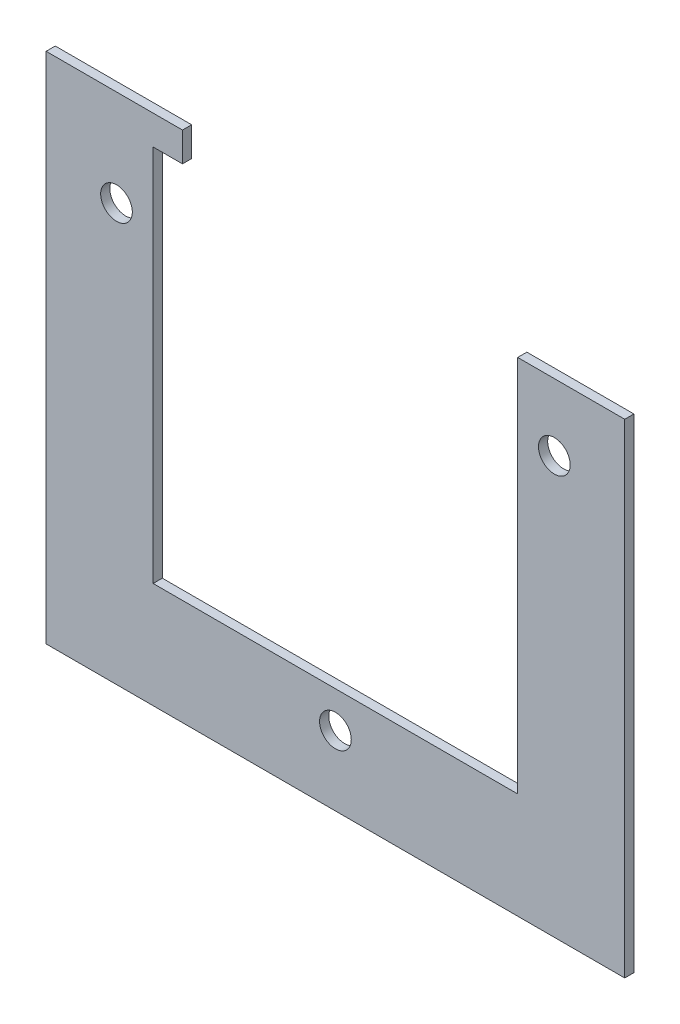
ISO-10303-21;
HEADER;
FILE_DESCRIPTION(('STEP AP214'),'2;1');
FILE_NAME('part.step','',(''),(''),'','','');
FILE_SCHEMA(('AUTOMOTIVE_DESIGN { 1 0 10303 214 1 1 1 1 }'));
ENDSEC;
DATA;
#1=APPLICATION_CONTEXT('core data for automotive mechanical design processes');
#2=APPLICATION_PROTOCOL_DEFINITION('international standard','automotive_design',2000,#1);
#3=PRODUCT_CONTEXT('',#1,'mechanical');
#4=PRODUCT('Part','Part','',(#3));
#5=PRODUCT_RELATED_PRODUCT_CATEGORY('part','',(#4));
#6=PRODUCT_DEFINITION_FORMATION('','',#4);
#7=PRODUCT_DEFINITION_CONTEXT('part definition',#1,'design');
#8=PRODUCT_DEFINITION('design','',#6,#7);
#9=PRODUCT_DEFINITION_SHAPE('','',#8);
#10=(LENGTH_UNIT() NAMED_UNIT(*) SI_UNIT(.MILLI.,.METRE.));
#11=(NAMED_UNIT(*) PLANE_ANGLE_UNIT() SI_UNIT($,.RADIAN.));
#12=(NAMED_UNIT(*) SI_UNIT($,.STERADIAN.) SOLID_ANGLE_UNIT());
#13=UNCERTAINTY_MEASURE_WITH_UNIT(LENGTH_MEASURE(1.E-05),#10,'distance_accuracy_value','');
#14=(GEOMETRIC_REPRESENTATION_CONTEXT(3) GLOBAL_UNCERTAINTY_ASSIGNED_CONTEXT((#13)) GLOBAL_UNIT_ASSIGNED_CONTEXT((#10,
#11,#12)) REPRESENTATION_CONTEXT('',''));
#15=CARTESIAN_POINT('',(0.,0.,0.));
#16=DIRECTION('',(0.,0.,1.));
#17=DIRECTION('',(1.,0.,0.));
#18=AXIS2_PLACEMENT_3D('',#15,#16,#17);
#19=CARTESIAN_POINT('',(0.,0.,0.79375));
#20=DIRECTION('',(0.,0.,-1.));
#21=DIRECTION('',(-1.,0.,0.));
#22=AXIS2_PLACEMENT_3D('',#19,#20,#21);
#23=PLANE('',#22);
#24=CARTESIAN_POINT('',(7523.2575610023,3421.82109597681,0.79375));
#25=DIRECTION('',(0.,0.,1.));
#26=DIRECTION('',(1.,0.,0.));
#27=AXIS2_PLACEMENT_3D('',#24,#25,#26);
#28=CIRCLE('',#27,1.3715999999997);
#29=CARTESIAN_POINT('',(7524.6291610023,3421.82109597681,0.79375));
#30=VERTEX_POINT('',#29);
#31=EDGE_CURVE('E212',#30,#30,#28,.T.);
#32=ORIENTED_EDGE('',*,*,#31,.F.);
#33=EDGE_LOOP('',(#32));
#34=FACE_BOUND('',#33,.T.);
#35=DIRECTION('',(0.,-1.,0.));
#36=VECTOR('',#35,1.);
#37=CARTESIAN_POINT('',(7520.0825610023,3427.61229597682,0.79375));
#38=LINE('',#37,#36);
#39=CARTESIAN_POINT('',(7520.0825610023,3427.61229597682,0.79375));
#40=VERTEX_POINT('',#39);
#41=CARTESIAN_POINT('',(7520.0825610023,3394.87169597682,0.79375));
#42=VERTEX_POINT('',#41);
#43=EDGE_CURVE('E161',#40,#42,#38,.T.);
#44=ORIENTED_EDGE('',*,*,#43,.T.);
#45=DIRECTION('',(-1.,0.,0.));
#46=VECTOR('',#45,1.);
#47=CARTESIAN_POINT('',(7520.0825610023,3394.87169597682,0.79375));
#48=LINE('',#47,#46);
#49=CARTESIAN_POINT('',(7488.5103610023,3394.87169597682,0.79375));
#50=VERTEX_POINT('',#49);
#51=EDGE_CURVE('E99',#42,#50,#48,.T.);
#52=ORIENTED_EDGE('',*,*,#51,.T.);
#53=DIRECTION('',(0.,1.,0.));
#54=VECTOR('',#53,1.);
#55=CARTESIAN_POINT('',(7488.5103610023,3394.87169597682,0.79375));
#56=LINE('',#55,#54);
#57=CARTESIAN_POINT('',(7488.5103610023,3427.61229597682,0.79375));
#58=VERTEX_POINT('',#57);
#59=EDGE_CURVE('E182',#50,#58,#56,.T.);
#60=ORIENTED_EDGE('',*,*,#59,.T.);
#61=DIRECTION('',(1.,0.,0.));
#62=VECTOR('',#61,1.);
#63=CARTESIAN_POINT('',(7491.0503610023,3427.61229597682,0.79375));
#64=LINE('',#63,#62);
#65=CARTESIAN_POINT('',(7491.0503610023,3427.61229597682,0.79375));
#66=VERTEX_POINT('',#65);
#67=EDGE_CURVE('E201',#58,#66,#64,.T.);
#68=ORIENTED_EDGE('',*,*,#67,.T.);
#69=DIRECTION('',(0.,1.,0.));
#70=VECTOR('',#69,1.);
#71=CARTESIAN_POINT('',(7491.0503610023,3427.61229597682,0.79375));
#72=LINE('',#71,#70);
#73=CARTESIAN_POINT('',(7491.0503610023,3430.15229597682,0.79375));
#74=VERTEX_POINT('',#73);
#75=EDGE_CURVE('E198',#66,#74,#72,.T.);
#76=ORIENTED_EDGE('',*,*,#75,.T.);
#77=DIRECTION('',(-1.,0.,0.));
#78=VECTOR('',#77,1.);
#79=CARTESIAN_POINT('',(7479.2393610023,3430.15229597682,0.79375));
#80=LINE('',#79,#78);
#81=CARTESIAN_POINT('',(7479.2393610023,3430.15229597682,0.79375));
#82=VERTEX_POINT('',#81);
#83=EDGE_CURVE('E200',#74,#82,#80,.T.);
#84=ORIENTED_EDGE('',*,*,#83,.T.);
#85=DIRECTION('',(0.,-1.,0.));
#86=VECTOR('',#85,1.);
#87=CARTESIAN_POINT('',(7479.2393610023,3430.15229597682,0.79375));
#88=LINE('',#87,#86);
#89=CARTESIAN_POINT('',(7479.2393610023,3385.70229597682,0.79375));
#90=VERTEX_POINT('',#89);
#91=EDGE_CURVE('E124',#82,#90,#88,.T.);
#92=ORIENTED_EDGE('',*,*,#91,.T.);
#93=DIRECTION('',(1.,0.,0.));
#94=VECTOR('',#93,1.);
#95=CARTESIAN_POINT('',(7529.3535610023,3385.70229597682,0.79375));
#96=LINE('',#95,#94);
#97=CARTESIAN_POINT('',(7529.3535610023,3385.70229597682,0.79375));
#98=VERTEX_POINT('',#97);
#99=EDGE_CURVE('E118',#90,#98,#96,.T.);
#100=ORIENTED_EDGE('',*,*,#99,.T.);
#101=DIRECTION('',(0.,1.,0.));
#102=VECTOR('',#101,1.);
#103=CARTESIAN_POINT('',(7529.3535610023,3427.61229597682,0.79375));
#104=LINE('',#103,#102);
#105=CARTESIAN_POINT('',(7529.3535610023,3427.61229597682,0.79375));
#106=VERTEX_POINT('',#105);
#107=EDGE_CURVE('E122',#98,#106,#104,.T.);
#108=ORIENTED_EDGE('',*,*,#107,.T.);
#109=DIRECTION('',(-1.,0.,0.));
#110=VECTOR('',#109,1.);
#111=CARTESIAN_POINT('',(7520.0825610023,3427.61229597682,0.79375));
#112=LINE('',#111,#110);
#113=EDGE_CURVE('E50',#106,#40,#112,.T.);
#114=ORIENTED_EDGE('',*,*,#113,.T.);
#115=EDGE_LOOP('',(#44,#52,#60,#68,#76,#84,#92,#100,#108,#114));
#116=FACE_BOUND('',#115,.T.);
#117=CARTESIAN_POINT('',(7504.2964610023,3391.73492355912,0.79375));
#118=DIRECTION('',(0.,0.,1.));
#119=DIRECTION('',(1.,0.,0.));
#120=AXIS2_PLACEMENT_3D('',#117,#118,#119);
#121=CIRCLE('',#120,1.3715999999997);
#122=CARTESIAN_POINT('',(7505.6680610023,3391.73492355912,0.79375));
#123=VERTEX_POINT('',#122);
#124=EDGE_CURVE('E146',#123,#123,#121,.T.);
#125=ORIENTED_EDGE('',*,*,#124,.F.);
#126=EDGE_LOOP('',(#125));
#127=FACE_BOUND('',#126,.T.);
#128=CARTESIAN_POINT('',(7485.3353610023,3421.82109597681,0.79375));
#129=DIRECTION('',(0.,0.,1.));
#130=DIRECTION('',(1.,0.,0.));
#131=AXIS2_PLACEMENT_3D('',#128,#129,#130);
#132=CIRCLE('',#131,1.3715999999997);
#133=CARTESIAN_POINT('',(7486.7069610023,3421.82109597681,0.79375));
#134=VERTEX_POINT('',#133);
#135=EDGE_CURVE('E218',#134,#134,#132,.T.);
#136=ORIENTED_EDGE('',*,*,#135,.F.);
#137=EDGE_LOOP('',(#136));
#138=FACE_BOUND('',#137,.T.);
#139=ADVANCED_FACE('F33',(#34,#116,#127,#138),#23,.F.);
#140=CARTESIAN_POINT('',(0.,0.,0.));
#141=DIRECTION('',(0.,0.,-1.));
#142=DIRECTION('',(-1.,0.,0.));
#143=AXIS2_PLACEMENT_3D('',#140,#141,#142);
#144=PLANE('',#143);
#145=CARTESIAN_POINT('',(7523.2575610023,3421.82109597681,0.));
#146=DIRECTION('',(0.,0.,1.));
#147=DIRECTION('',(1.,0.,0.));
#148=AXIS2_PLACEMENT_3D('',#145,#146,#147);
#149=CIRCLE('',#148,1.3715999999997);
#150=CARTESIAN_POINT('',(7524.6291610023,3421.82109597681,0.));
#151=VERTEX_POINT('',#150);
#152=EDGE_CURVE('E215',#151,#151,#149,.T.);
#153=ORIENTED_EDGE('',*,*,#152,.T.);
#154=EDGE_LOOP('',(#153));
#155=FACE_BOUND('',#154,.T.);
#156=DIRECTION('',(0.,-1.,0.));
#157=VECTOR('',#156,1.);
#158=CARTESIAN_POINT('',(7520.0825610023,3427.61229597682,0.));
#159=LINE('',#158,#157);
#160=CARTESIAN_POINT('',(7520.0825610023,3427.61229597682,0.));
#161=VERTEX_POINT('',#160);
#162=CARTESIAN_POINT('',(7520.0825610023,3394.87169597682,0.));
#163=VERTEX_POINT('',#162);
#164=EDGE_CURVE('E142',#161,#163,#159,.T.);
#165=ORIENTED_EDGE('',*,*,#164,.F.);
#166=DIRECTION('',(-1.,0.,0.));
#167=VECTOR('',#166,1.);
#168=CARTESIAN_POINT('',(7520.0825610023,3427.61229597682,0.));
#169=LINE('',#168,#167);
#170=CARTESIAN_POINT('',(7529.3535610023,3427.61229597682,0.));
#171=VERTEX_POINT('',#170);
#172=EDGE_CURVE('E91',#171,#161,#169,.T.);
#173=ORIENTED_EDGE('',*,*,#172,.F.);
#174=DIRECTION('',(0.,1.,0.));
#175=VECTOR('',#174,1.);
#176=CARTESIAN_POINT('',(7529.3535610023,3427.61229597682,0.));
#177=LINE('',#176,#175);
#178=CARTESIAN_POINT('',(7529.3535610023,3385.70229597682,0.));
#179=VERTEX_POINT('',#178);
#180=EDGE_CURVE('E85',#179,#171,#177,.T.);
#181=ORIENTED_EDGE('',*,*,#180,.F.);
#182=DIRECTION('',(1.,0.,0.));
#183=VECTOR('',#182,1.);
#184=CARTESIAN_POINT('',(7529.3535610023,3385.70229597682,0.));
#185=LINE('',#184,#183);
#186=CARTESIAN_POINT('',(7479.2393610023,3385.70229597682,0.));
#187=VERTEX_POINT('',#186);
#188=EDGE_CURVE('E132',#187,#179,#185,.T.);
#189=ORIENTED_EDGE('',*,*,#188,.F.);
#190=DIRECTION('',(0.,-1.,0.));
#191=VECTOR('',#190,1.);
#192=CARTESIAN_POINT('',(7479.2393610023,3430.15229597682,0.));
#193=LINE('',#192,#191);
#194=CARTESIAN_POINT('',(7479.2393610023,3430.15229597682,0.));
#195=VERTEX_POINT('',#194);
#196=EDGE_CURVE('E156',#195,#187,#193,.T.);
#197=ORIENTED_EDGE('',*,*,#196,.F.);
#198=DIRECTION('',(-1.,0.,0.));
#199=VECTOR('',#198,1.);
#200=CARTESIAN_POINT('',(7479.2393610023,3430.15229597682,0.));
#201=LINE('',#200,#199);
#202=CARTESIAN_POINT('',(7491.0503610023,3430.15229597682,0.));
#203=VERTEX_POINT('',#202);
#204=EDGE_CURVE('E154',#203,#195,#201,.T.);
#205=ORIENTED_EDGE('',*,*,#204,.F.);
#206=DIRECTION('',(0.,1.,0.));
#207=VECTOR('',#206,1.);
#208=CARTESIAN_POINT('',(7491.0503610023,3427.61229597682,0.));
#209=LINE('',#208,#207);
#210=CARTESIAN_POINT('',(7491.0503610023,3427.61229597682,0.));
#211=VERTEX_POINT('',#210);
#212=EDGE_CURVE('E152',#211,#203,#209,.T.);
#213=ORIENTED_EDGE('',*,*,#212,.F.);
#214=DIRECTION('',(1.,0.,0.));
#215=VECTOR('',#214,1.);
#216=CARTESIAN_POINT('',(7491.0503610023,3427.61229597682,0.));
#217=LINE('',#216,#215);
#218=CARTESIAN_POINT('',(7488.5103610023,3427.61229597682,0.));
#219=VERTEX_POINT('',#218);
#220=EDGE_CURVE('E150',#219,#211,#217,.T.);
#221=ORIENTED_EDGE('',*,*,#220,.F.);
#222=DIRECTION('',(0.,1.,0.));
#223=VECTOR('',#222,1.);
#224=CARTESIAN_POINT('',(7488.5103610023,3394.87169597682,0.));
#225=LINE('',#224,#223);
#226=CARTESIAN_POINT('',(7488.5103610023,3394.87169597682,0.));
#227=VERTEX_POINT('',#226);
#228=EDGE_CURVE('E148',#227,#219,#225,.T.);
#229=ORIENTED_EDGE('',*,*,#228,.F.);
#230=DIRECTION('',(-1.,0.,0.));
#231=VECTOR('',#230,1.);
#232=CARTESIAN_POINT('',(7520.0825610023,3394.87169597682,0.));
#233=LINE('',#232,#231);
#234=EDGE_CURVE('E145',#163,#227,#233,.T.);
#235=ORIENTED_EDGE('',*,*,#234,.F.);
#236=EDGE_LOOP('',(#165,#173,#181,#189,#197,#205,#213,#221,#229,#235));
#237=FACE_BOUND('',#236,.T.);
#238=CARTESIAN_POINT('',(7504.2964610023,3391.73492355912,0.));
#239=DIRECTION('',(0.,0.,1.));
#240=DIRECTION('',(1.,0.,0.));
#241=AXIS2_PLACEMENT_3D('',#238,#239,#240);
#242=CIRCLE('',#241,1.3715999999997);
#243=CARTESIAN_POINT('',(7505.6680610023,3391.73492355912,0.));
#244=VERTEX_POINT('',#243);
#245=EDGE_CURVE('E209',#244,#244,#242,.T.);
#246=ORIENTED_EDGE('',*,*,#245,.T.);
#247=EDGE_LOOP('',(#246));
#248=FACE_BOUND('',#247,.T.);
#249=CARTESIAN_POINT('',(7485.3353610023,3421.82109597681,0.));
#250=DIRECTION('',(0.,0.,1.));
#251=DIRECTION('',(1.,0.,0.));
#252=AXIS2_PLACEMENT_3D('',#249,#250,#251);
#253=CIRCLE('',#252,1.3715999999997);
#254=CARTESIAN_POINT('',(7486.7069610023,3421.82109597681,0.));
#255=VERTEX_POINT('',#254);
#256=EDGE_CURVE('E221',#255,#255,#253,.T.);
#257=ORIENTED_EDGE('',*,*,#256,.T.);
#258=EDGE_LOOP('',(#257));
#259=FACE_BOUND('',#258,.T.);
#260=ADVANCED_FACE('F186',(#155,#237,#248,#259),#144,.T.);
#261=CARTESIAN_POINT('',(7520.0825610023,3427.61229597682,0.79375));
#262=DIRECTION('',(1.,0.,0.));
#263=DIRECTION('',(0.,0.,-1.));
#264=AXIS2_PLACEMENT_3D('',#261,#262,#263);
#265=PLANE('',#264);
#266=ORIENTED_EDGE('',*,*,#164,.T.);
#267=DIRECTION('',(0.,0.,-1.));
#268=VECTOR('',#267,1.);
#269=CARTESIAN_POINT('',(7520.0825610023,3394.87169597682,0.79375));
#270=LINE('',#269,#268);
#271=EDGE_CURVE('E11',#42,#163,#270,.T.);
#272=ORIENTED_EDGE('',*,*,#271,.F.);
#273=ORIENTED_EDGE('',*,*,#43,.F.);
#274=DIRECTION('',(0.,0.,-1.));
#275=VECTOR('',#274,1.);
#276=CARTESIAN_POINT('',(7520.0825610023,3427.61229597682,0.79375));
#277=LINE('',#276,#275);
#278=EDGE_CURVE('E138',#40,#161,#277,.T.);
#279=ORIENTED_EDGE('',*,*,#278,.T.);
#280=EDGE_LOOP('',(#266,#272,#273,#279));
#281=FACE_BOUND('',#280,.T.);
#282=ADVANCED_FACE('F35',(#281),#265,.F.);
#283=CARTESIAN_POINT('',(7520.0825610023,3394.87169597682,0.79375));
#284=DIRECTION('',(0.,-1.,0.));
#285=DIRECTION('',(0.,0.,-1.));
#286=AXIS2_PLACEMENT_3D('',#283,#284,#285);
#287=PLANE('',#286);
#288=ORIENTED_EDGE('',*,*,#234,.T.);
#289=DIRECTION('',(0.,0.,-1.));
#290=VECTOR('',#289,1.);
#291=CARTESIAN_POINT('',(7488.5103610023,3394.87169597682,0.79375));
#292=LINE('',#291,#290);
#293=EDGE_CURVE('E42',#50,#227,#292,.T.);
#294=ORIENTED_EDGE('',*,*,#293,.F.);
#295=ORIENTED_EDGE('',*,*,#51,.F.);
#296=ORIENTED_EDGE('',*,*,#271,.T.);
#297=EDGE_LOOP('',(#288,#294,#295,#296));
#298=FACE_BOUND('',#297,.T.);
#299=ADVANCED_FACE('F263',(#298),#287,.F.);
#300=CARTESIAN_POINT('',(7488.5103610023,3394.87169597682,0.79375));
#301=DIRECTION('',(-1.,0.,0.));
#302=DIRECTION('',(0.,0.,1.));
#303=AXIS2_PLACEMENT_3D('',#300,#301,#302);
#304=PLANE('',#303);
#305=ORIENTED_EDGE('',*,*,#228,.T.);
#306=DIRECTION('',(0.,0.,-1.));
#307=VECTOR('',#306,1.);
#308=CARTESIAN_POINT('',(7488.5103610023,3427.61229597682,0.79375));
#309=LINE('',#308,#307);
#310=EDGE_CURVE('E174',#58,#219,#309,.T.);
#311=ORIENTED_EDGE('',*,*,#310,.F.);
#312=ORIENTED_EDGE('',*,*,#59,.F.);
#313=ORIENTED_EDGE('',*,*,#293,.T.);
#314=EDGE_LOOP('',(#305,#311,#312,#313));
#315=FACE_BOUND('',#314,.T.);
#316=ADVANCED_FACE('F180',(#315),#304,.F.);
#317=CARTESIAN_POINT('',(7491.0503610023,3427.61229597682,0.79375));
#318=DIRECTION('',(0.,1.,0.));
#319=DIRECTION('',(0.,0.,1.));
#320=AXIS2_PLACEMENT_3D('',#317,#318,#319);
#321=PLANE('',#320);
#322=ORIENTED_EDGE('',*,*,#220,.T.);
#323=DIRECTION('',(0.,0.,-1.));
#324=VECTOR('',#323,1.);
#325=CARTESIAN_POINT('',(7491.0503610023,3427.61229597682,0.79375));
#326=LINE('',#325,#324);
#327=EDGE_CURVE('E171',#66,#211,#326,.T.);
#328=ORIENTED_EDGE('',*,*,#327,.F.);
#329=ORIENTED_EDGE('',*,*,#67,.F.);
#330=ORIENTED_EDGE('',*,*,#310,.T.);
#331=EDGE_LOOP('',(#322,#328,#329,#330));
#332=FACE_BOUND('',#331,.T.);
#333=ADVANCED_FACE('F192',(#332),#321,.F.);
#334=CARTESIAN_POINT('',(7491.0503610023,3427.61229597682,0.79375));
#335=DIRECTION('',(-1.,0.,0.));
#336=DIRECTION('',(0.,0.,1.));
#337=AXIS2_PLACEMENT_3D('',#334,#335,#336);
#338=PLANE('',#337);
#339=ORIENTED_EDGE('',*,*,#212,.T.);
#340=DIRECTION('',(0.,0.,-1.));
#341=VECTOR('',#340,1.);
#342=CARTESIAN_POINT('',(7491.0503610023,3430.15229597682,0.79375));
#343=LINE('',#342,#341);
#344=EDGE_CURVE('E168',#74,#203,#343,.T.);
#345=ORIENTED_EDGE('',*,*,#344,.F.);
#346=ORIENTED_EDGE('',*,*,#75,.F.);
#347=ORIENTED_EDGE('',*,*,#327,.T.);
#348=EDGE_LOOP('',(#339,#345,#346,#347));
#349=FACE_BOUND('',#348,.T.);
#350=ADVANCED_FACE('F196',(#349),#338,.F.);
#351=CARTESIAN_POINT('',(7479.2393610023,3430.15229597682,0.79375));
#352=DIRECTION('',(0.,-1.,0.));
#353=DIRECTION('',(0.,0.,-1.));
#354=AXIS2_PLACEMENT_3D('',#351,#352,#353);
#355=PLANE('',#354);
#356=ORIENTED_EDGE('',*,*,#204,.T.);
#357=DIRECTION('',(0.,0.,-1.));
#358=VECTOR('',#357,1.);
#359=CARTESIAN_POINT('',(7479.2393610023,3430.15229597682,0.79375));
#360=LINE('',#359,#358);
#361=EDGE_CURVE('E165',#82,#195,#360,.T.);
#362=ORIENTED_EDGE('',*,*,#361,.F.);
#363=ORIENTED_EDGE('',*,*,#83,.F.);
#364=ORIENTED_EDGE('',*,*,#344,.T.);
#365=EDGE_LOOP('',(#356,#362,#363,#364));
#366=FACE_BOUND('',#365,.T.);
#367=ADVANCED_FACE('F253',(#366),#355,.F.);
#368=CARTESIAN_POINT('',(7479.2393610023,3430.15229597682,0.79375));
#369=DIRECTION('',(1.,0.,0.));
#370=DIRECTION('',(0.,0.,-1.));
#371=AXIS2_PLACEMENT_3D('',#368,#369,#370);
#372=PLANE('',#371);
#373=ORIENTED_EDGE('',*,*,#196,.T.);
#374=DIRECTION('',(0.,0.,-1.));
#375=VECTOR('',#374,1.);
#376=CARTESIAN_POINT('',(7479.2393610023,3385.70229597682,0.79375));
#377=LINE('',#376,#375);
#378=EDGE_CURVE('E133',#90,#187,#377,.T.);
#379=ORIENTED_EDGE('',*,*,#378,.F.);
#380=ORIENTED_EDGE('',*,*,#91,.F.);
#381=ORIENTED_EDGE('',*,*,#361,.T.);
#382=EDGE_LOOP('',(#373,#379,#380,#381));
#383=FACE_BOUND('',#382,.T.);
#384=ADVANCED_FACE('F250',(#383),#372,.F.);
#385=CARTESIAN_POINT('',(7529.3535610023,3385.70229597682,0.79375));
#386=DIRECTION('',(0.,1.,0.));
#387=DIRECTION('',(0.,0.,1.));
#388=AXIS2_PLACEMENT_3D('',#385,#386,#387);
#389=PLANE('',#388);
#390=ORIENTED_EDGE('',*,*,#188,.T.);
#391=DIRECTION('',(0.,0.,-1.));
#392=VECTOR('',#391,1.);
#393=CARTESIAN_POINT('',(7529.3535610023,3385.70229597682,0.79375));
#394=LINE('',#393,#392);
#395=EDGE_CURVE('E129',#98,#179,#394,.T.);
#396=ORIENTED_EDGE('',*,*,#395,.F.);
#397=ORIENTED_EDGE('',*,*,#99,.F.);
#398=ORIENTED_EDGE('',*,*,#378,.T.);
#399=EDGE_LOOP('',(#390,#396,#397,#398));
#400=FACE_BOUND('',#399,.T.);
#401=ADVANCED_FACE('F130',(#400),#389,.F.);
#402=CARTESIAN_POINT('',(7529.3535610023,3427.61229597682,0.79375));
#403=DIRECTION('',(-1.,0.,0.));
#404=DIRECTION('',(0.,0.,1.));
#405=AXIS2_PLACEMENT_3D('',#402,#403,#404);
#406=PLANE('',#405);
#407=ORIENTED_EDGE('',*,*,#180,.T.);
#408=DIRECTION('',(0.,0.,-1.));
#409=VECTOR('',#408,1.);
#410=CARTESIAN_POINT('',(7529.3535610023,3427.61229597682,0.79375));
#411=LINE('',#410,#409);
#412=EDGE_CURVE('E134',#106,#171,#411,.T.);
#413=ORIENTED_EDGE('',*,*,#412,.F.);
#414=ORIENTED_EDGE('',*,*,#107,.F.);
#415=ORIENTED_EDGE('',*,*,#395,.T.);
#416=EDGE_LOOP('',(#407,#413,#414,#415));
#417=FACE_BOUND('',#416,.T.);
#418=ADVANCED_FACE('F136',(#417),#406,.F.);
#419=CARTESIAN_POINT('',(7520.0825610023,3427.61229597682,0.79375));
#420=DIRECTION('',(0.,-1.,0.));
#421=DIRECTION('',(0.,0.,-1.));
#422=AXIS2_PLACEMENT_3D('',#419,#420,#421);
#423=PLANE('',#422);
#424=ORIENTED_EDGE('',*,*,#172,.T.);
#425=ORIENTED_EDGE('',*,*,#278,.F.);
#426=ORIENTED_EDGE('',*,*,#113,.F.);
#427=ORIENTED_EDGE('',*,*,#412,.T.);
#428=EDGE_LOOP('',(#424,#425,#426,#427));
#429=FACE_BOUND('',#428,.T.);
#430=ADVANCED_FACE('F243',(#429),#423,.F.);
#431=CARTESIAN_POINT('',(7504.2964610023,3391.73492355912,0.79375));
#432=DIRECTION('',(0.,0.,-1.));
#433=DIRECTION('',(-1.,0.,0.));
#434=AXIS2_PLACEMENT_3D('',#431,#432,#433);
#435=CYLINDRICAL_SURFACE('',#434,1.3715999999997);
#436=ORIENTED_EDGE('',*,*,#124,.T.);
#437=EDGE_LOOP('',(#436));
#438=FACE_BOUND('',#437,.T.);
#439=ORIENTED_EDGE('',*,*,#245,.F.);
#440=EDGE_LOOP('',(#439));
#441=FACE_BOUND('',#440,.T.);
#442=ADVANCED_FACE('F240',(#438,#441),#435,.F.);
#443=CARTESIAN_POINT('',(7523.2575610023,3421.82109597681,0.79375));
#444=DIRECTION('',(0.,0.,-1.));
#445=DIRECTION('',(-1.,0.,0.));
#446=AXIS2_PLACEMENT_3D('',#443,#444,#445);
#447=CYLINDRICAL_SURFACE('',#446,1.3715999999997);
#448=ORIENTED_EDGE('',*,*,#31,.T.);
#449=EDGE_LOOP('',(#448));
#450=FACE_BOUND('',#449,.T.);
#451=ORIENTED_EDGE('',*,*,#152,.F.);
#452=EDGE_LOOP('',(#451));
#453=FACE_BOUND('',#452,.T.);
#454=ADVANCED_FACE('F339',(#450,#453),#447,.F.);
#455=CARTESIAN_POINT('',(7485.3353610023,3421.82109597681,0.79375));
#456=DIRECTION('',(0.,0.,-1.));
#457=DIRECTION('',(-1.,0.,0.));
#458=AXIS2_PLACEMENT_3D('',#455,#456,#457);
#459=CYLINDRICAL_SURFACE('',#458,1.3715999999997);
#460=ORIENTED_EDGE('',*,*,#135,.T.);
#461=EDGE_LOOP('',(#460));
#462=FACE_BOUND('',#461,.T.);
#463=ORIENTED_EDGE('',*,*,#256,.F.);
#464=EDGE_LOOP('',(#463));
#465=FACE_BOUND('',#464,.T.);
#466=ADVANCED_FACE('F227',(#462,#465),#459,.F.);
#467=CLOSED_SHELL('',(#139,#260,#282,#299,#316,#333,#350,#367,#384,#401,#418,#430,#442,#454,#466));
#468=MANIFOLD_SOLID_BREP('B2',#467);
#469=ADVANCED_BREP_SHAPE_REPRESENTATION('',(#18,#468),#14);
#470=SHAPE_DEFINITION_REPRESENTATION(#9,#469);
ENDSEC;
END-ISO-10303-21;
